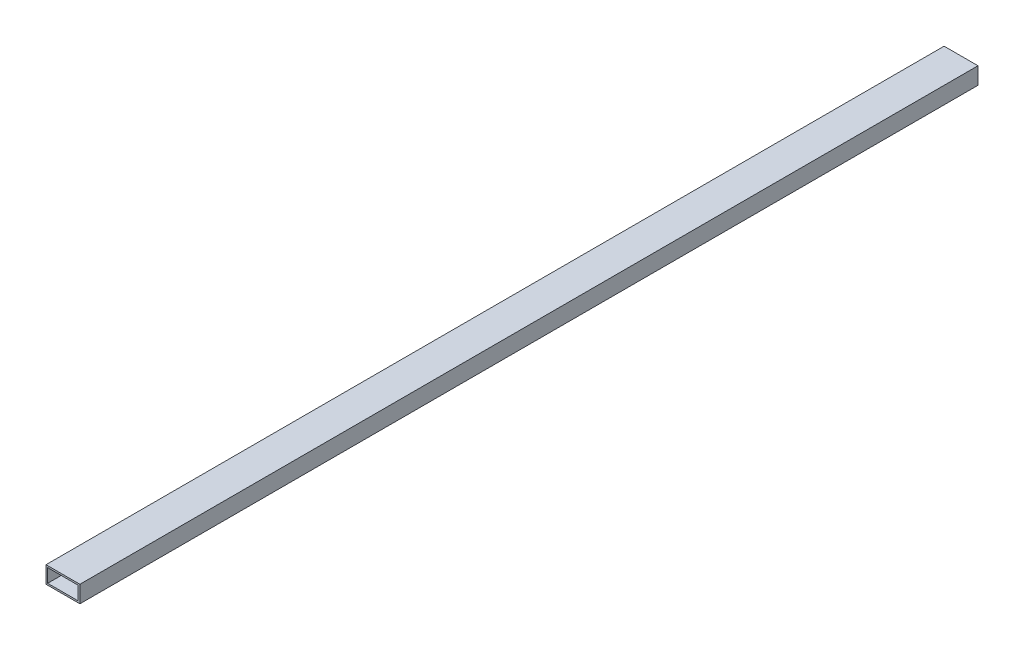
ISO-10303-21;
HEADER;
FILE_DESCRIPTION(('STEP AP214'),'2;1');
FILE_NAME('part.step','',(''),(''),'','','');
FILE_SCHEMA(('AUTOMOTIVE_DESIGN { 1 0 10303 214 1 1 1 1 }'));
ENDSEC;
DATA;
#1=APPLICATION_CONTEXT('core data for automotive mechanical design processes');
#2=APPLICATION_PROTOCOL_DEFINITION('international standard','automotive_design',2000,#1);
#3=PRODUCT_CONTEXT('',#1,'mechanical');
#4=PRODUCT('Part','Part','',(#3));
#5=PRODUCT_RELATED_PRODUCT_CATEGORY('part','',(#4));
#6=PRODUCT_DEFINITION_FORMATION('','',#4);
#7=PRODUCT_DEFINITION_CONTEXT('part definition',#1,'design');
#8=PRODUCT_DEFINITION('design','',#6,#7);
#9=PRODUCT_DEFINITION_SHAPE('','',#8);
#10=(LENGTH_UNIT() NAMED_UNIT(*) SI_UNIT(.MILLI.,.METRE.));
#11=(NAMED_UNIT(*) PLANE_ANGLE_UNIT() SI_UNIT($,.RADIAN.));
#12=(NAMED_UNIT(*) SI_UNIT($,.STERADIAN.) SOLID_ANGLE_UNIT());
#13=UNCERTAINTY_MEASURE_WITH_UNIT(LENGTH_MEASURE(1.E-05),#10,'distance_accuracy_value','');
#14=(GEOMETRIC_REPRESENTATION_CONTEXT(3) GLOBAL_UNCERTAINTY_ASSIGNED_CONTEXT((#13)) GLOBAL_UNIT_ASSIGNED_CONTEXT((#10,
#11,#12)) REPRESENTATION_CONTEXT('',''));
#15=CARTESIAN_POINT('',(0.,0.,0.));
#16=DIRECTION('',(0.,0.,1.));
#17=DIRECTION('',(1.,0.,0.));
#18=AXIS2_PLACEMENT_3D('',#15,#16,#17);
#19=CARTESIAN_POINT('',(-20.,-10.,1060.));
#20=DIRECTION('',(0.,0.,1.));
#21=DIRECTION('',(1.,0.,0.));
#22=AXIS2_PLACEMENT_3D('',#19,#20,#21);
#23=PLANE('',#22);
#24=DIRECTION('',(0.,-1.,0.));
#25=VECTOR('',#24,1.);
#26=CARTESIAN_POINT('',(-20.,-10.,1060.));
#27=LINE('',#26,#25);
#28=CARTESIAN_POINT('',(-20.,10.,1060.));
#29=VERTEX_POINT('',#28);
#30=CARTESIAN_POINT('',(-20.,-10.,1060.));
#31=VERTEX_POINT('',#30);
#32=EDGE_CURVE('E156',#29,#31,#27,.T.);
#33=ORIENTED_EDGE('',*,*,#32,.T.);
#34=DIRECTION('',(1.,0.,0.));
#35=VECTOR('',#34,1.);
#36=CARTESIAN_POINT('',(20.,-10.,1060.));
#37=LINE('',#36,#35);
#38=CARTESIAN_POINT('',(20.,-10.,1060.));
#39=VERTEX_POINT('',#38);
#40=EDGE_CURVE('E159',#31,#39,#37,.T.);
#41=ORIENTED_EDGE('',*,*,#40,.T.);
#42=DIRECTION('',(0.,1.,0.));
#43=VECTOR('',#42,1.);
#44=CARTESIAN_POINT('',(20.,-10.,1060.));
#45=LINE('',#44,#43);
#46=CARTESIAN_POINT('',(20.,10.,1060.));
#47=VERTEX_POINT('',#46);
#48=EDGE_CURVE('E162',#39,#47,#45,.T.);
#49=ORIENTED_EDGE('',*,*,#48,.T.);
#50=DIRECTION('',(-1.,0.,0.));
#51=VECTOR('',#50,1.);
#52=CARTESIAN_POINT('',(20.,10.,1060.));
#53=LINE('',#52,#51);
#54=EDGE_CURVE('E164',#47,#29,#53,.T.);
#55=ORIENTED_EDGE('',*,*,#54,.T.);
#56=EDGE_LOOP('',(#33,#41,#49,#55));
#57=FACE_BOUND('',#56,.T.);
#58=DIRECTION('',(1.,0.,0.));
#59=VECTOR('',#58,1.);
#60=CARTESIAN_POINT('',(20.,-8.,1060.));
#61=LINE('',#60,#59);
#62=CARTESIAN_POINT('',(-18.,-8.,1060.));
#63=VERTEX_POINT('',#62);
#64=CARTESIAN_POINT('',(18.,-8.,1060.));
#65=VERTEX_POINT('',#64);
#66=EDGE_CURVE('E128',#63,#65,#61,.T.);
#67=ORIENTED_EDGE('',*,*,#66,.F.);
#68=DIRECTION('',(0.,-1.,0.));
#69=VECTOR('',#68,1.);
#70=CARTESIAN_POINT('',(-18.,-10.,1060.));
#71=LINE('',#70,#69);
#72=CARTESIAN_POINT('',(-18.,8.,1060.));
#73=VERTEX_POINT('',#72);
#74=EDGE_CURVE('E120',#73,#63,#71,.T.);
#75=ORIENTED_EDGE('',*,*,#74,.F.);
#76=DIRECTION('',(-1.,0.,0.));
#77=VECTOR('',#76,1.);
#78=CARTESIAN_POINT('',(20.,8.,1060.));
#79=LINE('',#78,#77);
#80=CARTESIAN_POINT('',(18.,8.,1060.));
#81=VERTEX_POINT('',#80);
#82=EDGE_CURVE('E142',#81,#73,#79,.T.);
#83=ORIENTED_EDGE('',*,*,#82,.F.);
#84=DIRECTION('',(0.,1.,0.));
#85=VECTOR('',#84,1.);
#86=CARTESIAN_POINT('',(18.,-10.,1060.));
#87=LINE('',#86,#85);
#88=EDGE_CURVE('E140',#65,#81,#87,.T.);
#89=ORIENTED_EDGE('',*,*,#88,.F.);
#90=EDGE_LOOP('',(#67,#75,#83,#89));
#91=FACE_BOUND('',#90,.T.);
#92=ADVANCED_FACE('F55',(#57,#91),#23,.T.);
#93=CARTESIAN_POINT('',(-20.,-10.,0.));
#94=DIRECTION('',(0.,0.,1.));
#95=DIRECTION('',(1.,0.,0.));
#96=AXIS2_PLACEMENT_3D('',#93,#94,#95);
#97=PLANE('',#96);
#98=DIRECTION('',(0.,-1.,0.));
#99=VECTOR('',#98,1.);
#100=CARTESIAN_POINT('',(-20.,-10.,0.));
#101=LINE('',#100,#99);
#102=CARTESIAN_POINT('',(-20.,10.,0.));
#103=VERTEX_POINT('',#102);
#104=CARTESIAN_POINT('',(-20.,-10.,0.));
#105=VERTEX_POINT('',#104);
#106=EDGE_CURVE('E136',#103,#105,#101,.T.);
#107=ORIENTED_EDGE('',*,*,#106,.F.);
#108=DIRECTION('',(-1.,0.,0.));
#109=VECTOR('',#108,1.);
#110=CARTESIAN_POINT('',(20.,10.,0.));
#111=LINE('',#110,#109);
#112=CARTESIAN_POINT('',(20.,10.,0.));
#113=VERTEX_POINT('',#112);
#114=EDGE_CURVE('E160',#113,#103,#111,.T.);
#115=ORIENTED_EDGE('',*,*,#114,.F.);
#116=DIRECTION('',(0.,1.,0.));
#117=VECTOR('',#116,1.);
#118=CARTESIAN_POINT('',(20.,-10.,0.));
#119=LINE('',#118,#117);
#120=CARTESIAN_POINT('',(20.,-10.,0.));
#121=VERTEX_POINT('',#120);
#122=EDGE_CURVE('E171',#121,#113,#119,.T.);
#123=ORIENTED_EDGE('',*,*,#122,.F.);
#124=DIRECTION('',(1.,0.,0.));
#125=VECTOR('',#124,1.);
#126=CARTESIAN_POINT('',(20.,-10.,0.));
#127=LINE('',#126,#125);
#128=EDGE_CURVE('E169',#105,#121,#127,.T.);
#129=ORIENTED_EDGE('',*,*,#128,.F.);
#130=EDGE_LOOP('',(#107,#115,#123,#129));
#131=FACE_BOUND('',#130,.T.);
#132=DIRECTION('',(0.,-1.,0.));
#133=VECTOR('',#132,1.);
#134=CARTESIAN_POINT('',(-18.,-10.,0.));
#135=LINE('',#134,#133);
#136=CARTESIAN_POINT('',(-18.,8.,0.));
#137=VERTEX_POINT('',#136);
#138=CARTESIAN_POINT('',(-18.,-8.,0.));
#139=VERTEX_POINT('',#138);
#140=EDGE_CURVE('E78',#137,#139,#135,.T.);
#141=ORIENTED_EDGE('',*,*,#140,.T.);
#142=DIRECTION('',(1.,0.,0.));
#143=VECTOR('',#142,1.);
#144=CARTESIAN_POINT('',(20.,-8.,0.));
#145=LINE('',#144,#143);
#146=CARTESIAN_POINT('',(18.,-8.,0.));
#147=VERTEX_POINT('',#146);
#148=EDGE_CURVE('E135',#139,#147,#145,.T.);
#149=ORIENTED_EDGE('',*,*,#148,.T.);
#150=DIRECTION('',(0.,1.,0.));
#151=VECTOR('',#150,1.);
#152=CARTESIAN_POINT('',(18.,-10.,0.));
#153=LINE('',#152,#151);
#154=CARTESIAN_POINT('',(18.,8.,0.));
#155=VERTEX_POINT('',#154);
#156=EDGE_CURVE('E148',#147,#155,#153,.T.);
#157=ORIENTED_EDGE('',*,*,#156,.T.);
#158=DIRECTION('',(-1.,0.,0.));
#159=VECTOR('',#158,1.);
#160=CARTESIAN_POINT('',(20.,8.,0.));
#161=LINE('',#160,#159);
#162=EDGE_CURVE('E129',#155,#137,#161,.T.);
#163=ORIENTED_EDGE('',*,*,#162,.T.);
#164=EDGE_LOOP('',(#141,#149,#157,#163));
#165=FACE_BOUND('',#164,.T.);
#166=ADVANCED_FACE('F189',(#131,#165),#97,.F.);
#167=CARTESIAN_POINT('',(-20.,-10.,1060.));
#168=DIRECTION('',(1.,0.,0.));
#169=DIRECTION('',(0.,0.,-1.));
#170=AXIS2_PLACEMENT_3D('',#167,#168,#169);
#171=PLANE('',#170);
#172=ORIENTED_EDGE('',*,*,#106,.T.);
#173=DIRECTION('',(0.,0.,-1.));
#174=VECTOR('',#173,1.);
#175=CARTESIAN_POINT('',(-20.,-10.,1060.));
#176=LINE('',#175,#174);
#177=EDGE_CURVE('E12',#31,#105,#176,.T.);
#178=ORIENTED_EDGE('',*,*,#177,.F.);
#179=ORIENTED_EDGE('',*,*,#32,.F.);
#180=DIRECTION('',(0.,0.,-1.));
#181=VECTOR('',#180,1.);
#182=CARTESIAN_POINT('',(-20.,10.,1060.));
#183=LINE('',#182,#181);
#184=EDGE_CURVE('E166',#29,#103,#183,.T.);
#185=ORIENTED_EDGE('',*,*,#184,.T.);
#186=EDGE_LOOP('',(#172,#178,#179,#185));
#187=FACE_BOUND('',#186,.T.);
#188=ADVANCED_FACE('F57',(#187),#171,.F.);
#189=CARTESIAN_POINT('',(20.,-10.,1060.));
#190=DIRECTION('',(0.,1.,0.));
#191=DIRECTION('',(0.,0.,1.));
#192=AXIS2_PLACEMENT_3D('',#189,#190,#191);
#193=PLANE('',#192);
#194=ORIENTED_EDGE('',*,*,#128,.T.);
#195=DIRECTION('',(0.,0.,-1.));
#196=VECTOR('',#195,1.);
#197=CARTESIAN_POINT('',(20.,-10.,1060.));
#198=LINE('',#197,#196);
#199=EDGE_CURVE('E63',#39,#121,#198,.T.);
#200=ORIENTED_EDGE('',*,*,#199,.F.);
#201=ORIENTED_EDGE('',*,*,#40,.F.);
#202=ORIENTED_EDGE('',*,*,#177,.T.);
#203=EDGE_LOOP('',(#194,#200,#201,#202));
#204=FACE_BOUND('',#203,.T.);
#205=ADVANCED_FACE('F199',(#204),#193,.F.);
#206=CARTESIAN_POINT('',(20.,-10.,1060.));
#207=DIRECTION('',(-1.,0.,0.));
#208=DIRECTION('',(0.,0.,1.));
#209=AXIS2_PLACEMENT_3D('',#206,#207,#208);
#210=PLANE('',#209);
#211=ORIENTED_EDGE('',*,*,#122,.T.);
#212=DIRECTION('',(0.,0.,-1.));
#213=VECTOR('',#212,1.);
#214=CARTESIAN_POINT('',(20.,10.,1060.));
#215=LINE('',#214,#213);
#216=EDGE_CURVE('E176',#47,#113,#215,.T.);
#217=ORIENTED_EDGE('',*,*,#216,.F.);
#218=ORIENTED_EDGE('',*,*,#48,.F.);
#219=ORIENTED_EDGE('',*,*,#199,.T.);
#220=EDGE_LOOP('',(#211,#217,#218,#219));
#221=FACE_BOUND('',#220,.T.);
#222=ADVANCED_FACE('F183',(#221),#210,.F.);
#223=CARTESIAN_POINT('',(20.,10.,1060.));
#224=DIRECTION('',(0.,-1.,0.));
#225=DIRECTION('',(1.,0.,0.));
#226=AXIS2_PLACEMENT_3D('',#223,#224,#225);
#227=PLANE('',#226);
#228=ORIENTED_EDGE('',*,*,#114,.T.);
#229=ORIENTED_EDGE('',*,*,#184,.F.);
#230=ORIENTED_EDGE('',*,*,#54,.F.);
#231=ORIENTED_EDGE('',*,*,#216,.T.);
#232=EDGE_LOOP('',(#228,#229,#230,#231));
#233=FACE_BOUND('',#232,.T.);
#234=ADVANCED_FACE('F193',(#233),#227,.F.);
#235=CARTESIAN_POINT('',(-18.,-10.,1060.));
#236=DIRECTION('',(1.,0.,0.));
#237=DIRECTION('',(0.,0.,-1.));
#238=AXIS2_PLACEMENT_3D('',#235,#236,#237);
#239=PLANE('',#238);
#240=ORIENTED_EDGE('',*,*,#140,.F.);
#241=DIRECTION('',(0.,0.,-1.));
#242=VECTOR('',#241,1.);
#243=CARTESIAN_POINT('',(-18.,8.,1060.));
#244=LINE('',#243,#242);
#245=EDGE_CURVE('E124',#73,#137,#244,.T.);
#246=ORIENTED_EDGE('',*,*,#245,.F.);
#247=ORIENTED_EDGE('',*,*,#74,.T.);
#248=DIRECTION('',(0.,0.,-1.));
#249=VECTOR('',#248,1.);
#250=CARTESIAN_POINT('',(-18.,-8.,1060.));
#251=LINE('',#250,#249);
#252=EDGE_CURVE('E123',#63,#139,#251,.T.);
#253=ORIENTED_EDGE('',*,*,#252,.T.);
#254=EDGE_LOOP('',(#240,#246,#247,#253));
#255=FACE_BOUND('',#254,.T.);
#256=ADVANCED_FACE('F122',(#255),#239,.T.);
#257=CARTESIAN_POINT('',(20.,-8.,1060.));
#258=DIRECTION('',(0.,1.,0.));
#259=DIRECTION('',(0.,0.,1.));
#260=AXIS2_PLACEMENT_3D('',#257,#258,#259);
#261=PLANE('',#260);
#262=ORIENTED_EDGE('',*,*,#148,.F.);
#263=ORIENTED_EDGE('',*,*,#252,.F.);
#264=ORIENTED_EDGE('',*,*,#66,.T.);
#265=DIRECTION('',(0.,0.,-1.));
#266=VECTOR('',#265,1.);
#267=CARTESIAN_POINT('',(18.,-8.,1060.));
#268=LINE('',#267,#266);
#269=EDGE_CURVE('E137',#65,#147,#268,.T.);
#270=ORIENTED_EDGE('',*,*,#269,.T.);
#271=EDGE_LOOP('',(#262,#263,#264,#270));
#272=FACE_BOUND('',#271,.T.);
#273=ADVANCED_FACE('F132',(#272),#261,.T.);
#274=CARTESIAN_POINT('',(18.,-10.,1060.));
#275=DIRECTION('',(-1.,0.,0.));
#276=DIRECTION('',(0.,0.,1.));
#277=AXIS2_PLACEMENT_3D('',#274,#275,#276);
#278=PLANE('',#277);
#279=ORIENTED_EDGE('',*,*,#156,.F.);
#280=ORIENTED_EDGE('',*,*,#269,.F.);
#281=ORIENTED_EDGE('',*,*,#88,.T.);
#282=DIRECTION('',(0.,0.,-1.));
#283=VECTOR('',#282,1.);
#284=CARTESIAN_POINT('',(18.,8.,1060.));
#285=LINE('',#284,#283);
#286=EDGE_CURVE('E70',#81,#155,#285,.T.);
#287=ORIENTED_EDGE('',*,*,#286,.T.);
#288=EDGE_LOOP('',(#279,#280,#281,#287));
#289=FACE_BOUND('',#288,.T.);
#290=ADVANCED_FACE('F222',(#289),#278,.T.);
#291=CARTESIAN_POINT('',(20.,8.,1060.));
#292=DIRECTION('',(0.,-1.,0.));
#293=DIRECTION('',(1.,0.,0.));
#294=AXIS2_PLACEMENT_3D('',#291,#292,#293);
#295=PLANE('',#294);
#296=ORIENTED_EDGE('',*,*,#162,.F.);
#297=ORIENTED_EDGE('',*,*,#286,.F.);
#298=ORIENTED_EDGE('',*,*,#82,.T.);
#299=ORIENTED_EDGE('',*,*,#245,.T.);
#300=EDGE_LOOP('',(#296,#297,#298,#299));
#301=FACE_BOUND('',#300,.T.);
#302=ADVANCED_FACE('F226',(#301),#295,.T.);
#303=CLOSED_SHELL('',(#92,#166,#188,#205,#222,#234,#256,#273,#290,#302));
#304=MANIFOLD_SOLID_BREP('B2',#303);
#305=ADVANCED_BREP_SHAPE_REPRESENTATION('',(#18,#304),#14);
#306=SHAPE_DEFINITION_REPRESENTATION(#9,#305);
ENDSEC;
END-ISO-10303-21;
